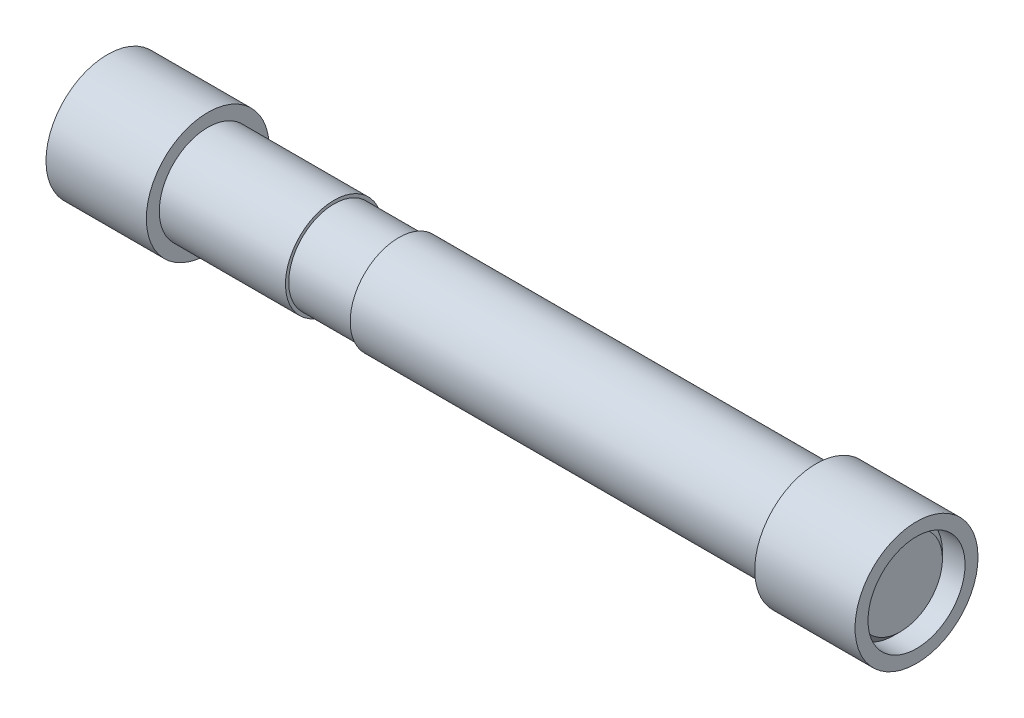
ISO-10303-21;
HEADER;
FILE_DESCRIPTION(('STEP AP214'),'2;1');
FILE_NAME('part.step','',(''),(''),'','','');
FILE_SCHEMA(('AUTOMOTIVE_DESIGN { 1 0 10303 214 1 1 1 1 }'));
ENDSEC;
DATA;
#1=APPLICATION_CONTEXT('core data for automotive mechanical design processes');
#2=APPLICATION_PROTOCOL_DEFINITION('international standard','automotive_design',2000,#1);
#3=PRODUCT_CONTEXT('',#1,'mechanical');
#4=PRODUCT('Part','Part','',(#3));
#5=PRODUCT_RELATED_PRODUCT_CATEGORY('part','',(#4));
#6=PRODUCT_DEFINITION_FORMATION('','',#4);
#7=PRODUCT_DEFINITION_CONTEXT('part definition',#1,'design');
#8=PRODUCT_DEFINITION('design','',#6,#7);
#9=PRODUCT_DEFINITION_SHAPE('','',#8);
#10=(LENGTH_UNIT() NAMED_UNIT(*) SI_UNIT(.MILLI.,.METRE.));
#11=(NAMED_UNIT(*) PLANE_ANGLE_UNIT() SI_UNIT($,.RADIAN.));
#12=(NAMED_UNIT(*) SI_UNIT($,.STERADIAN.) SOLID_ANGLE_UNIT());
#13=UNCERTAINTY_MEASURE_WITH_UNIT(LENGTH_MEASURE(1.E-05),#10,'distance_accuracy_value','');
#14=(GEOMETRIC_REPRESENTATION_CONTEXT(3) GLOBAL_UNCERTAINTY_ASSIGNED_CONTEXT((#13)) GLOBAL_UNIT_ASSIGNED_CONTEXT((#10,
#11,#12)) REPRESENTATION_CONTEXT('',''));
#15=CARTESIAN_POINT('',(0.,0.,0.));
#16=DIRECTION('',(0.,0.,1.));
#17=DIRECTION('',(1.,0.,0.));
#18=AXIS2_PLACEMENT_3D('',#15,#16,#17);
#19=CARTESIAN_POINT('',(-12.,30.,81.));
#20=DIRECTION('',(-1.,0.,0.));
#21=DIRECTION('',(0.,1.,0.));
#22=AXIS2_PLACEMENT_3D('',#19,#20,#21);
#23=PLANE('',#22);
#24=CARTESIAN_POINT('',(-12.,30.,81.));
#25=DIRECTION('',(-1.,0.,0.));
#26=DIRECTION('',(0.,0.947138844973947,0.320823952256401));
#27=AXIS2_PLACEMENT_3D('',#24,#25,#26);
#28=CIRCLE('',#27,1.3);
#29=CARTESIAN_POINT('',(-12.,31.2312804984661,81.4170711379334));
#30=VERTEX_POINT('',#29);
#31=EDGE_CURVE('E11',#30,#30,#28,.T.);
#32=ORIENTED_EDGE('',*,*,#31,.T.);
#33=EDGE_LOOP('',(#32));
#34=FACE_BOUND('',#33,.T.);
#35=ADVANCED_FACE('F38',(#34),#23,.T.);
#36=CARTESIAN_POINT('',(-12.,30.,81.));
#37=DIRECTION('',(1.,0.,0.));
#38=DIRECTION('',(0.,-0.947138844973947,-0.320823952256401));
#39=AXIS2_PLACEMENT_3D('',#36,#37,#38);
#40=CONICAL_SURFACE('',#39,1.3,0.785398163397446);
#41=ORIENTED_EDGE('',*,*,#31,.F.);
#42=EDGE_LOOP('',(#41));
#43=FACE_BOUND('',#42,.T.);
#44=CARTESIAN_POINT('',(-11.8,30.,81.));
#45=DIRECTION('',(1.,0.,0.));
#46=DIRECTION('',(0.,0.947138844973947,0.320823952256401));
#47=AXIS2_PLACEMENT_3D('',#44,#45,#46);
#48=CIRCLE('',#47,1.5);
#49=CARTESIAN_POINT('',(-11.8,31.4207082674608,81.4812359283847));
#50=VERTEX_POINT('',#49);
#51=EDGE_CURVE('E134',#50,#50,#48,.T.);
#52=ORIENTED_EDGE('',*,*,#51,.F.);
#53=EDGE_LOOP('',(#52));
#54=FACE_BOUND('',#53,.T.);
#55=ADVANCED_FACE('F192',(#43,#54),#40,.T.);
#56=CARTESIAN_POINT('',(-12.,30.,81.));
#57=DIRECTION('',(1.,0.,0.));
#58=DIRECTION('',(0.,-0.947138844973947,-0.320823952256401));
#59=AXIS2_PLACEMENT_3D('',#56,#57,#58);
#60=CYLINDRICAL_SURFACE('',#59,1.5);
#61=CARTESIAN_POINT('',(-5.49999999999994,30.,81.));
#62=DIRECTION('',(1.,0.,0.));
#63=DIRECTION('',(0.,-0.947138844973947,-0.320823952256401));
#64=AXIS2_PLACEMENT_3D('',#61,#62,#63);
#65=CIRCLE('',#64,1.5);
#66=CARTESIAN_POINT('',(-5.49999999999994,28.579291732539,80.5187640716155));
#67=VERTEX_POINT('',#66);
#68=EDGE_CURVE('E139',#67,#67,#65,.T.);
#69=ORIENTED_EDGE('',*,*,#68,.F.);
#70=EDGE_LOOP('',(#69));
#71=FACE_BOUND('',#70,.T.);
#72=CARTESIAN_POINT('',(-9.4,30.,81.));
#73=DIRECTION('',(-1.,0.,0.));
#74=DIRECTION('',(0.,0.746654905866277,0.66521158404362));
#75=AXIS2_PLACEMENT_3D('',#72,#73,#74);
#76=CIRCLE('',#75,1.5);
#77=CARTESIAN_POINT('',(-9.4,31.1199823587994,81.9978173760655));
#78=VERTEX_POINT('',#77);
#79=EDGE_CURVE('E148',#78,#78,#76,.T.);
#80=ORIENTED_EDGE('',*,*,#79,.F.);
#81=EDGE_LOOP('',(#80));
#82=FACE_BOUND('',#81,.T.);
#83=ADVANCED_FACE('F196',(#71,#82),#60,.T.);
#84=CARTESIAN_POINT('',(12.5,30.,81.));
#85=DIRECTION('',(1.,0.,0.));
#86=DIRECTION('',(0.,0.,-1.));
#87=AXIS2_PLACEMENT_3D('',#84,#85,#86);
#88=PLANE('',#87);
#89=CARTESIAN_POINT('',(12.5,30.,81.));
#90=DIRECTION('',(1.,0.,0.));
#91=DIRECTION('',(0.,-0.746654905866277,-0.66521158404362));
#92=AXIS2_PLACEMENT_3D('',#89,#90,#91);
#93=CIRCLE('',#92,1.5);
#94=CARTESIAN_POINT('',(12.5,28.8800176412005,80.0021826239346));
#95=VERTEX_POINT('',#94);
#96=EDGE_CURVE('E49',#95,#95,#93,.T.);
#97=ORIENTED_EDGE('',*,*,#96,.F.);
#98=EDGE_LOOP('',(#97));
#99=FACE_BOUND('',#98,.T.);
#100=CARTESIAN_POINT('',(12.5,30.,81.));
#101=DIRECTION('',(1.,0.,0.));
#102=DIRECTION('',(0.,-0.746654905866276,-0.66521158404362));
#103=AXIS2_PLACEMENT_3D('',#100,#101,#102);
#104=CIRCLE('',#103,1.9);
#105=CARTESIAN_POINT('',(12.5,28.581355678854,79.7360979903172));
#106=VERTEX_POINT('',#105);
#107=EDGE_CURVE('E106',#106,#106,#104,.T.);
#108=ORIENTED_EDGE('',*,*,#107,.T.);
#109=EDGE_LOOP('',(#108));
#110=FACE_BOUND('',#109,.T.);
#111=ADVANCED_FACE('F202',(#99,#110),#88,.T.);
#112=CARTESIAN_POINT('',(12.5,30.,81.));
#113=DIRECTION('',(-1.,0.,0.));
#114=DIRECTION('',(0.,0.746654905866277,0.66521158404362));
#115=AXIS2_PLACEMENT_3D('',#112,#113,#114);
#116=CYLINDRICAL_SURFACE('',#115,1.5);
#117=CARTESIAN_POINT('',(11.8,30.,81.));
#118=DIRECTION('',(1.,0.,0.));
#119=DIRECTION('',(0.,0.,1.));
#120=AXIS2_PLACEMENT_3D('',#117,#118,#119);
#121=CIRCLE('',#120,1.5);
#122=CARTESIAN_POINT('',(11.8,30.,82.5));
#123=VERTEX_POINT('',#122);
#124=EDGE_CURVE('E144',#123,#123,#121,.T.);
#125=ORIENTED_EDGE('',*,*,#124,.F.);
#126=EDGE_LOOP('',(#125));
#127=FACE_BOUND('',#126,.T.);
#128=ORIENTED_EDGE('',*,*,#96,.T.);
#129=EDGE_LOOP('',(#128));
#130=FACE_BOUND('',#129,.T.);
#131=ADVANCED_FACE('F227',(#127,#130),#116,.F.);
#132=CARTESIAN_POINT('',(9.4,30.,81.));
#133=DIRECTION('',(1.,0.,0.));
#134=DIRECTION('',(0.,-0.746654905866276,-0.66521158404362));
#135=AXIS2_PLACEMENT_3D('',#132,#133,#134);
#136=CYLINDRICAL_SURFACE('',#135,1.9);
#137=CARTESIAN_POINT('',(9.4,30.,81.));
#138=DIRECTION('',(1.,0.,0.));
#139=DIRECTION('',(0.,-0.746654905866276,-0.66521158404362));
#140=AXIS2_PLACEMENT_3D('',#137,#138,#139);
#141=CIRCLE('',#140,1.9);
#142=CARTESIAN_POINT('',(9.4,28.581355678854,79.7360979903172));
#143=VERTEX_POINT('',#142);
#144=EDGE_CURVE('E113',#143,#143,#141,.T.);
#145=ORIENTED_EDGE('',*,*,#144,.T.);
#146=EDGE_LOOP('',(#145));
#147=FACE_BOUND('',#146,.T.);
#148=ORIENTED_EDGE('',*,*,#107,.F.);
#149=EDGE_LOOP('',(#148));
#150=FACE_BOUND('',#149,.T.);
#151=ADVANCED_FACE('F230',(#147,#150),#136,.T.);
#152=CARTESIAN_POINT('',(9.4,30.,81.));
#153=DIRECTION('',(1.,0.,0.));
#154=DIRECTION('',(0.,0.,-1.));
#155=AXIS2_PLACEMENT_3D('',#152,#153,#154);
#156=PLANE('',#155);
#157=CARTESIAN_POINT('',(9.4,30.,81.));
#158=DIRECTION('',(1.,0.,0.));
#159=DIRECTION('',(0.,-0.746654905866277,-0.66521158404362));
#160=AXIS2_PLACEMENT_3D('',#157,#158,#159);
#161=CIRCLE('',#160,1.5);
#162=CARTESIAN_POINT('',(9.4,28.8800176412005,80.0021826239346));
#163=VERTEX_POINT('',#162);
#164=EDGE_CURVE('E138',#163,#163,#161,.T.);
#165=ORIENTED_EDGE('',*,*,#164,.T.);
#166=EDGE_LOOP('',(#165));
#167=FACE_BOUND('',#166,.T.);
#168=ORIENTED_EDGE('',*,*,#144,.F.);
#169=EDGE_LOOP('',(#168));
#170=FACE_BOUND('',#169,.T.);
#171=ADVANCED_FACE('F172',(#167,#170),#156,.F.);
#172=CARTESIAN_POINT('',(-5.49999999999994,30.,81.));
#173=DIRECTION('',(1.,0.,0.));
#174=DIRECTION('',(0.,-0.947138844973949,-0.320823952256397));
#175=AXIS2_PLACEMENT_3D('',#172,#173,#174);
#176=CYLINDRICAL_SURFACE('',#175,1.4);
#177=CARTESIAN_POINT('',(-5.49999999999994,30.,81.));
#178=DIRECTION('',(1.,0.,0.));
#179=DIRECTION('',(0.,-0.947138844973949,-0.320823952256397));
#180=AXIS2_PLACEMENT_3D('',#177,#178,#179);
#181=CIRCLE('',#180,1.4);
#182=CARTESIAN_POINT('',(-5.49999999999994,28.6740056170364,80.5508464668411));
#183=VERTEX_POINT('',#182);
#184=EDGE_CURVE('E42',#183,#183,#181,.T.);
#185=ORIENTED_EDGE('',*,*,#184,.T.);
#186=EDGE_LOOP('',(#185));
#187=FACE_BOUND('',#186,.T.);
#188=CARTESIAN_POINT('',(-3.49999999999994,30.,81.));
#189=DIRECTION('',(1.,0.,0.));
#190=DIRECTION('',(0.,-0.947138844973949,-0.320823952256397));
#191=AXIS2_PLACEMENT_3D('',#188,#189,#190);
#192=CIRCLE('',#191,1.4);
#193=CARTESIAN_POINT('',(-3.49999999999994,28.6740056170364,80.5508464668411));
#194=VERTEX_POINT('',#193);
#195=EDGE_CURVE('E160',#194,#194,#192,.T.);
#196=ORIENTED_EDGE('',*,*,#195,.F.);
#197=EDGE_LOOP('',(#196));
#198=FACE_BOUND('',#197,.T.);
#199=ADVANCED_FACE('F223',(#187,#198),#176,.T.);
#200=CARTESIAN_POINT('',(-3.49999999999994,30.,81.));
#201=DIRECTION('',(1.,0.,0.));
#202=DIRECTION('',(0.,0.,-1.));
#203=AXIS2_PLACEMENT_3D('',#200,#201,#202);
#204=PLANE('',#203);
#205=ORIENTED_EDGE('',*,*,#195,.T.);
#206=EDGE_LOOP('',(#205));
#207=FACE_BOUND('',#206,.T.);
#208=CARTESIAN_POINT('',(-3.49999999999994,30.,81.));
#209=DIRECTION('',(1.,0.,0.));
#210=DIRECTION('',(0.,-0.947138844973947,-0.320823952256401));
#211=AXIS2_PLACEMENT_3D('',#208,#209,#210);
#212=CIRCLE('',#211,1.5);
#213=CARTESIAN_POINT('',(-3.49999999999994,28.579291732539,80.5187640716155));
#214=VERTEX_POINT('',#213);
#215=EDGE_CURVE('E141',#214,#214,#212,.T.);
#216=ORIENTED_EDGE('',*,*,#215,.F.);
#217=EDGE_LOOP('',(#216));
#218=FACE_BOUND('',#217,.T.);
#219=ADVANCED_FACE('F187',(#207,#218),#204,.F.);
#220=CARTESIAN_POINT('',(-5.49999999999994,30.,81.));
#221=DIRECTION('',(1.,0.,0.));
#222=DIRECTION('',(0.,0.,-1.));
#223=AXIS2_PLACEMENT_3D('',#220,#221,#222);
#224=PLANE('',#223);
#225=ORIENTED_EDGE('',*,*,#184,.F.);
#226=EDGE_LOOP('',(#225));
#227=FACE_BOUND('',#226,.T.);
#228=ORIENTED_EDGE('',*,*,#68,.T.);
#229=EDGE_LOOP('',(#228));
#230=FACE_BOUND('',#229,.T.);
#231=ADVANCED_FACE('F178',(#227,#230),#224,.T.);
#232=CARTESIAN_POINT('',(-12.,30.,81.));
#233=DIRECTION('',(1.,0.,0.));
#234=DIRECTION('',(0.,-0.947138844973947,-0.320823952256401));
#235=AXIS2_PLACEMENT_3D('',#232,#233,#234);
#236=CYLINDRICAL_SURFACE('',#235,1.5);
#237=ORIENTED_EDGE('',*,*,#215,.T.);
#238=EDGE_LOOP('',(#237));
#239=FACE_BOUND('',#238,.T.);
#240=ORIENTED_EDGE('',*,*,#164,.F.);
#241=EDGE_LOOP('',(#240));
#242=FACE_BOUND('',#241,.T.);
#243=ADVANCED_FACE('F175',(#239,#242),#236,.T.);
#244=CARTESIAN_POINT('',(12.,30.,81.));
#245=DIRECTION('',(-1.,0.,0.));
#246=DIRECTION('',(0.,1.,0.));
#247=AXIS2_PLACEMENT_3D('',#244,#245,#246);
#248=PLANE('',#247);
#249=CARTESIAN_POINT('',(12.,30.,81.));
#250=DIRECTION('',(1.,0.,0.));
#251=DIRECTION('',(0.,0.947138844973946,0.320823952256403));
#252=AXIS2_PLACEMENT_3D('',#249,#250,#251);
#253=CIRCLE('',#252,1.3);
#254=CARTESIAN_POINT('',(12.,31.231280498466,81.4170711379334));
#255=VERTEX_POINT('',#254);
#256=EDGE_CURVE('E147',#255,#255,#253,.T.);
#257=ORIENTED_EDGE('',*,*,#256,.T.);
#258=EDGE_LOOP('',(#257));
#259=FACE_BOUND('',#258,.T.);
#260=ADVANCED_FACE('F177',(#259),#248,.F.);
#261=CARTESIAN_POINT('',(11.8,30.,81.));
#262=DIRECTION('',(-1.,0.,0.));
#263=DIRECTION('',(0.,0.947138844973947,0.320823952256402));
#264=AXIS2_PLACEMENT_3D('',#261,#262,#263);
#265=CONICAL_SURFACE('',#264,1.5,0.785398163397453);
#266=ORIENTED_EDGE('',*,*,#256,.F.);
#267=EDGE_LOOP('',(#266));
#268=FACE_BOUND('',#267,.T.);
#269=ORIENTED_EDGE('',*,*,#124,.T.);
#270=EDGE_LOOP('',(#269));
#271=FACE_BOUND('',#270,.T.);
#272=ADVANCED_FACE('F185',(#268,#271),#265,.T.);
#273=CARTESIAN_POINT('',(-9.4,30.,81.));
#274=DIRECTION('',(-1.,0.,0.));
#275=DIRECTION('',(0.,0.,1.));
#276=AXIS2_PLACEMENT_3D('',#273,#274,#275);
#277=PLANE('',#276);
#278=ORIENTED_EDGE('',*,*,#79,.T.);
#279=EDGE_LOOP('',(#278));
#280=FACE_BOUND('',#279,.T.);
#281=CARTESIAN_POINT('',(-9.4,30.,81.));
#282=DIRECTION('',(-1.,0.,0.));
#283=DIRECTION('',(0.,0.746654905866276,0.66521158404362));
#284=AXIS2_PLACEMENT_3D('',#281,#282,#283);
#285=CIRCLE('',#284,1.9);
#286=CARTESIAN_POINT('',(-9.4,31.4186443211459,82.2639020096829));
#287=VERTEX_POINT('',#286);
#288=EDGE_CURVE('E149',#287,#287,#285,.T.);
#289=ORIENTED_EDGE('',*,*,#288,.F.);
#290=EDGE_LOOP('',(#289));
#291=FACE_BOUND('',#290,.T.);
#292=ADVANCED_FACE('F206',(#280,#291),#277,.F.);
#293=CARTESIAN_POINT('',(-9.4,30.,81.));
#294=DIRECTION('',(-1.,0.,0.));
#295=DIRECTION('',(0.,0.746654905866276,0.66521158404362));
#296=AXIS2_PLACEMENT_3D('',#293,#294,#295);
#297=CYLINDRICAL_SURFACE('',#296,1.9);
#298=ORIENTED_EDGE('',*,*,#288,.T.);
#299=EDGE_LOOP('',(#298));
#300=FACE_BOUND('',#299,.T.);
#301=CARTESIAN_POINT('',(-12.5,30.,81.));
#302=DIRECTION('',(-1.,0.,0.));
#303=DIRECTION('',(0.,0.746654905866276,0.66521158404362));
#304=AXIS2_PLACEMENT_3D('',#301,#302,#303);
#305=CIRCLE('',#304,1.9);
#306=CARTESIAN_POINT('',(-12.5,31.4186443211459,82.2639020096829));
#307=VERTEX_POINT('',#306);
#308=EDGE_CURVE('E124',#307,#307,#305,.T.);
#309=ORIENTED_EDGE('',*,*,#308,.F.);
#310=EDGE_LOOP('',(#309));
#311=FACE_BOUND('',#310,.T.);
#312=ADVANCED_FACE('F204',(#300,#311),#297,.T.);
#313=CARTESIAN_POINT('',(-12.5,30.,81.));
#314=DIRECTION('',(1.,0.,0.));
#315=DIRECTION('',(0.,-0.746654905866277,-0.66521158404362));
#316=AXIS2_PLACEMENT_3D('',#313,#314,#315);
#317=CYLINDRICAL_SURFACE('',#316,1.5);
#318=CARTESIAN_POINT('',(-12.5,30.,81.));
#319=DIRECTION('',(-1.,0.,0.));
#320=DIRECTION('',(0.,0.746654905866277,0.66521158404362));
#321=AXIS2_PLACEMENT_3D('',#318,#319,#320);
#322=CIRCLE('',#321,1.5);
#323=CARTESIAN_POINT('',(-12.5,31.1199823587994,81.9978173760655));
#324=VERTEX_POINT('',#323);
#325=EDGE_CURVE('E128',#324,#324,#322,.T.);
#326=ORIENTED_EDGE('',*,*,#325,.T.);
#327=EDGE_LOOP('',(#326));
#328=FACE_BOUND('',#327,.T.);
#329=ORIENTED_EDGE('',*,*,#51,.T.);
#330=EDGE_LOOP('',(#329));
#331=FACE_BOUND('',#330,.T.);
#332=ADVANCED_FACE('F40',(#328,#331),#317,.F.);
#333=CARTESIAN_POINT('',(-12.5,30.,81.));
#334=DIRECTION('',(-1.,0.,0.));
#335=DIRECTION('',(0.,0.,1.));
#336=AXIS2_PLACEMENT_3D('',#333,#334,#335);
#337=PLANE('',#336);
#338=ORIENTED_EDGE('',*,*,#325,.F.);
#339=EDGE_LOOP('',(#338));
#340=FACE_BOUND('',#339,.T.);
#341=ORIENTED_EDGE('',*,*,#308,.T.);
#342=EDGE_LOOP('',(#341));
#343=FACE_BOUND('',#342,.T.);
#344=ADVANCED_FACE('F125',(#340,#343),#337,.T.);
#345=CLOSED_SHELL('',(#35,#55,#83,#111,#131,#151,#171,#199,#219,#231,#243,#260,#272,#292,#312,
#332,#344));
#346=MANIFOLD_SOLID_BREP('B2',#345);
#347=ADVANCED_BREP_SHAPE_REPRESENTATION('',(#18,#346),#14);
#348=SHAPE_DEFINITION_REPRESENTATION(#9,#347);
ENDSEC;
END-ISO-10303-21;
